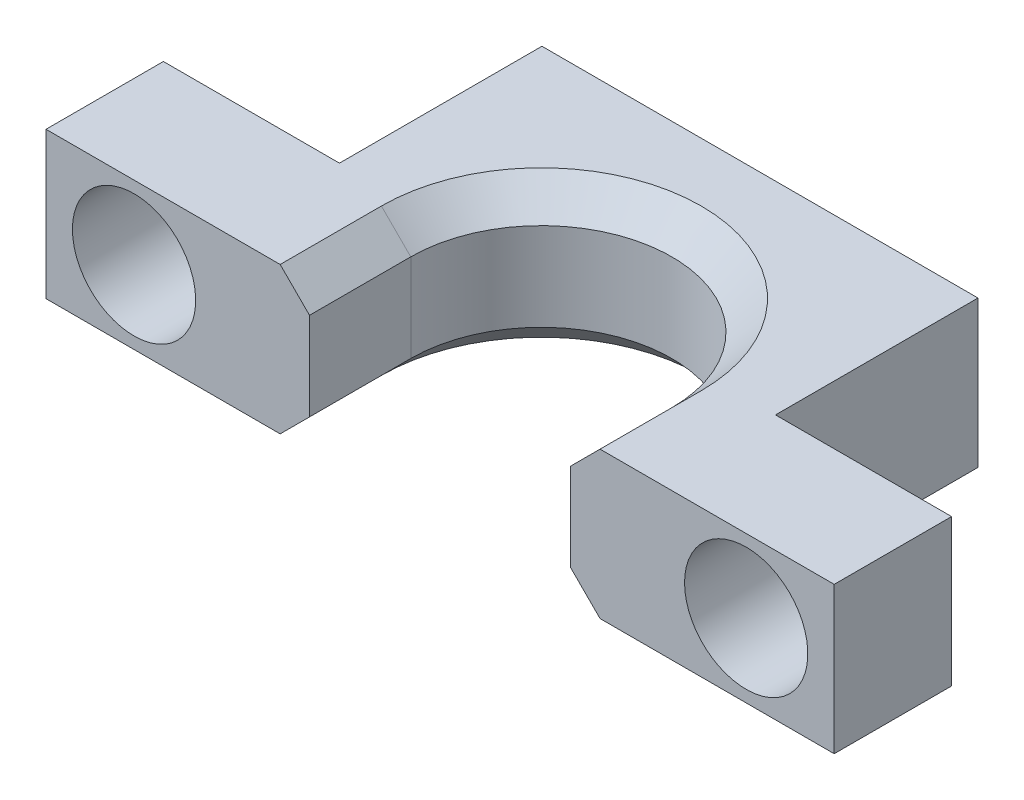
ISO-10303-21;
HEADER;
FILE_DESCRIPTION(('STEP AP214'),'2;1');
FILE_NAME('part.step','',(''),(''),'','','');
FILE_SCHEMA(('AUTOMOTIVE_DESIGN { 1 0 10303 214 1 1 1 1 }'));
ENDSEC;
DATA;
#1=APPLICATION_CONTEXT('core data for automotive mechanical design processes');
#2=APPLICATION_PROTOCOL_DEFINITION('international standard','automotive_design',2000,#1);
#3=PRODUCT_CONTEXT('',#1,'mechanical');
#4=PRODUCT('Part','Part','',(#3));
#5=PRODUCT_RELATED_PRODUCT_CATEGORY('part','',(#4));
#6=PRODUCT_DEFINITION_FORMATION('','',#4);
#7=PRODUCT_DEFINITION_CONTEXT('part definition',#1,'design');
#8=PRODUCT_DEFINITION('design','',#6,#7);
#9=PRODUCT_DEFINITION_SHAPE('','',#8);
#10=(LENGTH_UNIT() NAMED_UNIT(*) SI_UNIT(.MILLI.,.METRE.));
#11=(NAMED_UNIT(*) PLANE_ANGLE_UNIT() SI_UNIT($,.RADIAN.));
#12=(NAMED_UNIT(*) SI_UNIT($,.STERADIAN.) SOLID_ANGLE_UNIT());
#13=UNCERTAINTY_MEASURE_WITH_UNIT(LENGTH_MEASURE(1.E-05),#10,'distance_accuracy_value','');
#14=(GEOMETRIC_REPRESENTATION_CONTEXT(3) GLOBAL_UNCERTAINTY_ASSIGNED_CONTEXT((#13)) GLOBAL_UNIT_ASSIGNED_CONTEXT((#10,
#11,#12)) REPRESENTATION_CONTEXT('',''));
#15=CARTESIAN_POINT('',(0.,0.,0.));
#16=DIRECTION('',(0.,0.,1.));
#17=DIRECTION('',(1.,0.,0.));
#18=AXIS2_PLACEMENT_3D('',#15,#16,#17);
#19=CARTESIAN_POINT('',(0.,0.,0.));
#20=DIRECTION('',(0.,1.,0.));
#21=DIRECTION('',(0.,0.,1.));
#22=AXIS2_PLACEMENT_3D('',#19,#20,#21);
#23=PLANE('',#22);
#24=CARTESIAN_POINT('',(36.0770144996435,0.,-19.4606428772498));
#25=DIRECTION('',(0.,1.,0.));
#26=DIRECTION('',(0.,0.,1.));
#27=AXIS2_PLACEMENT_3D('',#24,#25,#26);
#28=CIRCLE('',#27,2.725);
#29=CARTESIAN_POINT('',(38.8020144996435,0.,-19.4606428772498));
#30=VERTEX_POINT('',#29);
#31=CARTESIAN_POINT('',(33.3520144996435,0.,-19.4606428772498));
#32=VERTEX_POINT('',#31);
#33=EDGE_CURVE('E219',#30,#32,#28,.T.);
#34=ORIENTED_EDGE('',*,*,#33,.T.);
#35=DIRECTION('',(0.,0.,1.));
#36=VECTOR('',#35,1.);
#37=CARTESIAN_POINT('',(33.3520144996435,0.,-17.7356428772498));
#38=LINE('',#37,#36);
#39=CARTESIAN_POINT('',(33.3520144996435,0.,-17.7356428772498));
#40=VERTEX_POINT('',#39);
#41=EDGE_CURVE('E221',#32,#40,#38,.T.);
#42=ORIENTED_EDGE('',*,*,#41,.T.);
#43=DIRECTION('',(-1.,0.,0.));
#44=VECTOR('',#43,1.);
#45=CARTESIAN_POINT('',(0.,0.,-17.7356428772498));
#46=LINE('',#45,#44);
#47=CARTESIAN_POINT('',(29.3621793754421,0.,-17.7356428772498));
#48=VERTEX_POINT('',#47);
#49=EDGE_CURVE('E212',#40,#48,#46,.T.);
#50=ORIENTED_EDGE('',*,*,#49,.T.);
#51=DIRECTION('',(0.,0.,-1.));
#52=VECTOR('',#51,1.);
#53=CARTESIAN_POINT('',(29.3621793754421,0.,0.));
#54=LINE('',#53,#52);
#55=CARTESIAN_POINT('',(29.3621793754421,0.,-19.7356428772498));
#56=VERTEX_POINT('',#55);
#57=EDGE_CURVE('E209',#48,#56,#54,.T.);
#58=ORIENTED_EDGE('',*,*,#57,.T.);
#59=DIRECTION('',(-1.,0.,0.));
#60=VECTOR('',#59,1.);
#61=CARTESIAN_POINT('',(0.,0.,-19.7356428772498));
#62=LINE('',#61,#60);
#63=CARTESIAN_POINT('',(32.3621793754421,0.,-19.7356428772498));
#64=VERTEX_POINT('',#63);
#65=EDGE_CURVE('E207',#64,#56,#62,.T.);
#66=ORIENTED_EDGE('',*,*,#65,.F.);
#67=DIRECTION('',(0.,0.,1.));
#68=VECTOR('',#67,1.);
#69=CARTESIAN_POINT('',(32.3621793754421,0.,0.));
#70=LINE('',#69,#68);
#71=CARTESIAN_POINT('',(32.3621793754421,0.,-23.1856428772498));
#72=VERTEX_POINT('',#71);
#73=EDGE_CURVE('E205',#72,#64,#70,.T.);
#74=ORIENTED_EDGE('',*,*,#73,.F.);
#75=DIRECTION('',(1.,0.,0.));
#76=VECTOR('',#75,1.);
#77=CARTESIAN_POINT('',(0.,0.,-23.1856428772498));
#78=LINE('',#77,#76);
#79=CARTESIAN_POINT('',(39.7918496238448,0.,-23.1856428772498));
#80=VERTEX_POINT('',#79);
#81=EDGE_CURVE('E202',#72,#80,#78,.T.);
#82=ORIENTED_EDGE('',*,*,#81,.T.);
#83=DIRECTION('',(0.,0.,-1.));
#84=VECTOR('',#83,1.);
#85=CARTESIAN_POINT('',(39.7918496238448,0.,0.));
#86=LINE('',#85,#84);
#87=CARTESIAN_POINT('',(39.7918496238448,0.,-19.7356428772497));
#88=VERTEX_POINT('',#87);
#89=EDGE_CURVE('E200',#88,#80,#86,.T.);
#90=ORIENTED_EDGE('',*,*,#89,.F.);
#91=DIRECTION('',(1.,0.,0.));
#92=VECTOR('',#91,1.);
#93=CARTESIAN_POINT('',(0.,0.,-19.7356428772497));
#94=LINE('',#93,#92);
#95=CARTESIAN_POINT('',(42.7918496238448,0.,-19.7356428772497));
#96=VERTEX_POINT('',#95);
#97=EDGE_CURVE('E197',#88,#96,#94,.T.);
#98=ORIENTED_EDGE('',*,*,#97,.T.);
#99=DIRECTION('',(0.,0.,-1.));
#100=VECTOR('',#99,1.);
#101=CARTESIAN_POINT('',(42.7918496238448,0.,0.));
#102=LINE('',#101,#100);
#103=CARTESIAN_POINT('',(42.7918496238448,0.,-17.7356428772498));
#104=VERTEX_POINT('',#103);
#105=EDGE_CURVE('E195',#104,#96,#102,.T.);
#106=ORIENTED_EDGE('',*,*,#105,.F.);
#107=DIRECTION('',(-1.,0.,0.));
#108=VECTOR('',#107,1.);
#109=CARTESIAN_POINT('',(0.,0.,-17.7356428772498));
#110=LINE('',#109,#108);
#111=CARTESIAN_POINT('',(38.8020144996435,0.,-17.7356428772498));
#112=VERTEX_POINT('',#111);
#113=EDGE_CURVE('E165',#104,#112,#110,.T.);
#114=ORIENTED_EDGE('',*,*,#113,.T.);
#115=DIRECTION('',(0.,0.,-1.));
#116=VECTOR('',#115,1.);
#117=CARTESIAN_POINT('',(38.8020144996435,0.,0.));
#118=LINE('',#117,#116);
#119=EDGE_CURVE('E217',#112,#30,#118,.T.);
#120=ORIENTED_EDGE('',*,*,#119,.T.);
#121=EDGE_LOOP('',(#34,#42,#50,#58,#66,#74,#82,#90,#98,#106,#114,#120));
#122=FACE_BOUND('',#121,.T.);
#123=ADVANCED_FACE('F35',(#122),#23,.F.);
#124=CARTESIAN_POINT('',(38.3020144996435,2.500012,0.));
#125=DIRECTION('',(1.,0.,0.));
#126=DIRECTION('',(0.,0.,-1.));
#127=AXIS2_PLACEMENT_3D('',#124,#125,#126);
#128=PLANE('',#127);
#129=DIRECTION('',(0.,-1.,0.));
#130=VECTOR('',#129,1.);
#131=CARTESIAN_POINT('',(38.3020144996435,2.500012,-17.7356428772498));
#132=LINE('',#131,#130);
#133=CARTESIAN_POINT('',(38.3020144996435,2.00000000000001,-17.7356428772498));
#134=VERTEX_POINT('',#133);
#135=CARTESIAN_POINT('',(38.3020144996435,0.50000000000001,-17.7356428772498));
#136=VERTEX_POINT('',#135);
#137=EDGE_CURVE('E166',#134,#136,#132,.T.);
#138=ORIENTED_EDGE('',*,*,#137,.F.);
#139=DIRECTION('',(0.,0.,-1.));
#140=VECTOR('',#139,1.);
#141=CARTESIAN_POINT('',(38.3020144996435,2.,-19.4606428772498));
#142=LINE('',#141,#140);
#143=CARTESIAN_POINT('',(38.3020144996435,2.00000000000001,-19.4606428772498));
#144=VERTEX_POINT('',#143);
#145=EDGE_CURVE('E44',#134,#144,#142,.T.);
#146=ORIENTED_EDGE('',*,*,#145,.T.);
#147=DIRECTION('',(0.,1.,0.));
#148=VECTOR('',#147,1.);
#149=CARTESIAN_POINT('',(38.3020144996435,-12.5,-19.4606428772498));
#150=LINE('',#149,#148);
#151=CARTESIAN_POINT('',(38.3020144996435,0.500000000000009,-19.4606428772498));
#152=VERTEX_POINT('',#151);
#153=EDGE_CURVE('E239',#152,#144,#150,.T.);
#154=ORIENTED_EDGE('',*,*,#153,.F.);
#155=DIRECTION('',(0.,0.,1.));
#156=VECTOR('',#155,1.);
#157=CARTESIAN_POINT('',(38.3020144996435,0.500000000000009,0.));
#158=LINE('',#157,#156);
#159=EDGE_CURVE('E228',#152,#136,#158,.T.);
#160=ORIENTED_EDGE('',*,*,#159,.T.);
#161=EDGE_LOOP('',(#138,#146,#154,#160));
#162=FACE_BOUND('',#161,.T.);
#163=ADVANCED_FACE('F273',(#162),#128,.F.);
#164=CARTESIAN_POINT('',(33.8520144996435,2.500012,0.));
#165=DIRECTION('',(1.,0.,0.));
#166=DIRECTION('',(0.,0.,-1.));
#167=AXIS2_PLACEMENT_3D('',#164,#165,#166);
#168=PLANE('',#167);
#169=DIRECTION('',(0.,1.,0.));
#170=VECTOR('',#169,1.);
#171=CARTESIAN_POINT('',(33.8520144996435,-12.5,-19.4606428772498));
#172=LINE('',#171,#170);
#173=CARTESIAN_POINT('',(33.8520144996435,0.500000000000009,-19.4606428772498));
#174=VERTEX_POINT('',#173);
#175=CARTESIAN_POINT('',(33.8520144996435,2.00000000000001,-19.4606428772498));
#176=VERTEX_POINT('',#175);
#177=EDGE_CURVE('E334',#174,#176,#172,.T.);
#178=ORIENTED_EDGE('',*,*,#177,.T.);
#179=DIRECTION('',(0.,0.,1.));
#180=VECTOR('',#179,1.);
#181=CARTESIAN_POINT('',(33.8520144996435,2.,0.));
#182=LINE('',#181,#180);
#183=CARTESIAN_POINT('',(33.8520144996435,2.00000000000001,-17.7356428772498));
#184=VERTEX_POINT('',#183);
#185=EDGE_CURVE('E246',#176,#184,#182,.T.);
#186=ORIENTED_EDGE('',*,*,#185,.T.);
#187=DIRECTION('',(0.,-1.,0.));
#188=VECTOR('',#187,1.);
#189=CARTESIAN_POINT('',(33.8520144996435,2.500012,-17.7356428772498));
#190=LINE('',#189,#188);
#191=CARTESIAN_POINT('',(33.8520144996435,0.50000000000001,-17.7356428772498));
#192=VERTEX_POINT('',#191);
#193=EDGE_CURVE('E172',#184,#192,#190,.T.);
#194=ORIENTED_EDGE('',*,*,#193,.T.);
#195=DIRECTION('',(0.,0.,-1.));
#196=VECTOR('',#195,1.);
#197=CARTESIAN_POINT('',(33.8520144996435,0.500000000000009,-19.4606428772498));
#198=LINE('',#197,#196);
#199=EDGE_CURVE('E214',#192,#174,#198,.T.);
#200=ORIENTED_EDGE('',*,*,#199,.T.);
#201=EDGE_LOOP('',(#178,#186,#194,#200));
#202=FACE_BOUND('',#201,.T.);
#203=ADVANCED_FACE('F279',(#202),#168,.T.);
#204=CARTESIAN_POINT('',(0.,2.500012,-17.7356428772498));
#205=DIRECTION('',(0.,0.,-1.));
#206=DIRECTION('',(-1.,0.,0.));
#207=AXIS2_PLACEMENT_3D('',#204,#205,#206);
#208=PLANE('',#207);
#209=CARTESIAN_POINT('',(30.8621793754421,1.25,-17.7356428772498));
#210=DIRECTION('',(0.,0.,-1.));
#211=DIRECTION('',(-1.,0.,0.));
#212=AXIS2_PLACEMENT_3D('',#209,#210,#211);
#213=CIRCLE('',#212,1.05);
#214=CARTESIAN_POINT('',(29.8121793754421,1.25,-17.7356428772498));
#215=VERTEX_POINT('',#214);
#216=EDGE_CURVE('E341',#215,#215,#213,.T.);
#217=ORIENTED_EDGE('',*,*,#216,.T.);
#218=EDGE_LOOP('',(#217));
#219=FACE_BOUND('',#218,.T.);
#220=ORIENTED_EDGE('',*,*,#193,.F.);
#221=DIRECTION('',(0.707106781186546,-0.707106781186549,0.));
#222=VECTOR('',#221,1.);
#223=CARTESIAN_POINT('',(33.3520144996435,2.5,-17.7356428772498));
#224=LINE('',#223,#222);
#225=CARTESIAN_POINT('',(33.3520144996435,2.5,-17.7356428772498));
#226=VERTEX_POINT('',#225);
#227=EDGE_CURVE('E248',#184,#226,#224,.F.);
#228=ORIENTED_EDGE('',*,*,#227,.T.);
#229=DIRECTION('',(-1.,0.,0.));
#230=VECTOR('',#229,1.);
#231=CARTESIAN_POINT('',(0.,2.5,-17.7356428772498));
#232=LINE('',#231,#230);
#233=CARTESIAN_POINT('',(29.3621793754421,2.5,-17.7356428772498));
#234=VERTEX_POINT('',#233);
#235=EDGE_CURVE('E192',#226,#234,#232,.T.);
#236=ORIENTED_EDGE('',*,*,#235,.T.);
#237=DIRECTION('',(0.,-1.,0.));
#238=VECTOR('',#237,1.);
#239=CARTESIAN_POINT('',(29.3621793754421,2.500012,-17.7356428772498));
#240=LINE('',#239,#238);
#241=EDGE_CURVE('E174',#234,#48,#240,.T.);
#242=ORIENTED_EDGE('',*,*,#241,.T.);
#243=ORIENTED_EDGE('',*,*,#49,.F.);
#244=DIRECTION('',(0.707106781186542,0.707106781186553,0.));
#245=VECTOR('',#244,1.);
#246=CARTESIAN_POINT('',(33.8520144996435,0.500000000000009,-17.7356428772498));
#247=LINE('',#246,#245);
#248=EDGE_CURVE('E223',#40,#192,#247,.T.);
#249=ORIENTED_EDGE('',*,*,#248,.T.);
#250=EDGE_LOOP('',(#220,#228,#236,#242,#243,#249));
#251=FACE_BOUND('',#250,.T.);
#252=ADVANCED_FACE('F304',(#219,#251),#208,.F.);
#253=CARTESIAN_POINT('',(29.3621793754421,2.500012,0.));
#254=DIRECTION('',(1.,0.,0.));
#255=DIRECTION('',(0.,0.,-1.));
#256=AXIS2_PLACEMENT_3D('',#253,#254,#255);
#257=PLANE('',#256);
#258=DIRECTION('',(0.,0.,-1.));
#259=VECTOR('',#258,1.);
#260=CARTESIAN_POINT('',(29.3621793754421,2.5,0.));
#261=LINE('',#260,#259);
#262=CARTESIAN_POINT('',(29.3621793754421,2.5,-19.7356428772498));
#263=VERTEX_POINT('',#262);
#264=EDGE_CURVE('E190',#234,#263,#261,.T.);
#265=ORIENTED_EDGE('',*,*,#264,.T.);
#266=DIRECTION('',(0.,-1.,0.));
#267=VECTOR('',#266,1.);
#268=CARTESIAN_POINT('',(29.3621793754421,2.500012,-19.7356428772498));
#269=LINE('',#268,#267);
#270=EDGE_CURVE('E313',#263,#56,#269,.T.);
#271=ORIENTED_EDGE('',*,*,#270,.T.);
#272=ORIENTED_EDGE('',*,*,#57,.F.);
#273=ORIENTED_EDGE('',*,*,#241,.F.);
#274=EDGE_LOOP('',(#265,#271,#272,#273));
#275=FACE_BOUND('',#274,.T.);
#276=ADVANCED_FACE('F311',(#275),#257,.F.);
#277=CARTESIAN_POINT('',(0.,2.500012,-19.7356428772498));
#278=DIRECTION('',(0.,0.,-1.));
#279=DIRECTION('',(-1.,0.,0.));
#280=AXIS2_PLACEMENT_3D('',#277,#278,#279);
#281=PLANE('',#280);
#282=CARTESIAN_POINT('',(30.8621793754421,1.25,-19.7356428772497));
#283=DIRECTION('',(0.,0.,-1.));
#284=DIRECTION('',(-1.,0.,0.));
#285=AXIS2_PLACEMENT_3D('',#282,#283,#284);
#286=CIRCLE('',#285,1.05);
#287=CARTESIAN_POINT('',(29.8121793754421,1.25,-19.7356428772497));
#288=VERTEX_POINT('',#287);
#289=EDGE_CURVE('E344',#288,#288,#286,.T.);
#290=ORIENTED_EDGE('',*,*,#289,.F.);
#291=EDGE_LOOP('',(#290));
#292=FACE_BOUND('',#291,.T.);
#293=DIRECTION('',(0.,-1.,0.));
#294=VECTOR('',#293,1.);
#295=CARTESIAN_POINT('',(32.3621793754421,2.500012,-19.7356428772498));
#296=LINE('',#295,#294);
#297=CARTESIAN_POINT('',(32.3621793754421,2.5,-19.7356428772498));
#298=VERTEX_POINT('',#297);
#299=EDGE_CURVE('E319',#298,#64,#296,.T.);
#300=ORIENTED_EDGE('',*,*,#299,.T.);
#301=ORIENTED_EDGE('',*,*,#65,.T.);
#302=ORIENTED_EDGE('',*,*,#270,.F.);
#303=DIRECTION('',(-1.,0.,0.));
#304=VECTOR('',#303,1.);
#305=CARTESIAN_POINT('',(0.,2.5,-19.7356428772498));
#306=LINE('',#305,#304);
#307=EDGE_CURVE('E187',#298,#263,#306,.T.);
#308=ORIENTED_EDGE('',*,*,#307,.F.);
#309=EDGE_LOOP('',(#300,#301,#302,#308));
#310=FACE_BOUND('',#309,.T.);
#311=ADVANCED_FACE('F316',(#292,#310),#281,.T.);
#312=CARTESIAN_POINT('',(32.3621793754421,2.500012,0.));
#313=DIRECTION('',(-1.,0.,0.));
#314=DIRECTION('',(0.,0.,1.));
#315=AXIS2_PLACEMENT_3D('',#312,#313,#314);
#316=PLANE('',#315);
#317=DIRECTION('',(0.,-1.,0.));
#318=VECTOR('',#317,1.);
#319=CARTESIAN_POINT('',(32.3621793754421,2.500012,-23.1856428772498));
#320=LINE('',#319,#318);
#321=CARTESIAN_POINT('',(32.3621793754421,2.5,-23.1856428772498));
#322=VERTEX_POINT('',#321);
#323=EDGE_CURVE('E321',#322,#72,#320,.T.);
#324=ORIENTED_EDGE('',*,*,#323,.T.);
#325=ORIENTED_EDGE('',*,*,#73,.T.);
#326=ORIENTED_EDGE('',*,*,#299,.F.);
#327=DIRECTION('',(0.,0.,1.));
#328=VECTOR('',#327,1.);
#329=CARTESIAN_POINT('',(32.3621793754421,2.5,0.));
#330=LINE('',#329,#328);
#331=EDGE_CURVE('E184',#322,#298,#330,.T.);
#332=ORIENTED_EDGE('',*,*,#331,.F.);
#333=EDGE_LOOP('',(#324,#325,#326,#332));
#334=FACE_BOUND('',#333,.T.);
#335=ADVANCED_FACE('F351',(#334),#316,.T.);
#336=CARTESIAN_POINT('',(0.,2.500012,-23.1856428772498));
#337=DIRECTION('',(0.,0.,1.));
#338=DIRECTION('',(1.,0.,0.));
#339=AXIS2_PLACEMENT_3D('',#336,#337,#338);
#340=PLANE('',#339);
#341=DIRECTION('',(1.,0.,0.));
#342=VECTOR('',#341,1.);
#343=CARTESIAN_POINT('',(0.,2.5,-23.1856428772498));
#344=LINE('',#343,#342);
#345=CARTESIAN_POINT('',(39.7918496238448,2.5,-23.1856428772498));
#346=VERTEX_POINT('',#345);
#347=EDGE_CURVE('E182',#322,#346,#344,.T.);
#348=ORIENTED_EDGE('',*,*,#347,.T.);
#349=DIRECTION('',(0.,-1.,0.));
#350=VECTOR('',#349,1.);
#351=CARTESIAN_POINT('',(39.7918496238448,2.500012,-23.1856428772498));
#352=LINE('',#351,#350);
#353=EDGE_CURVE('E326',#346,#80,#352,.T.);
#354=ORIENTED_EDGE('',*,*,#353,.T.);
#355=ORIENTED_EDGE('',*,*,#81,.F.);
#356=ORIENTED_EDGE('',*,*,#323,.F.);
#357=EDGE_LOOP('',(#348,#354,#355,#356));
#358=FACE_BOUND('',#357,.T.);
#359=ADVANCED_FACE('F357',(#358),#340,.F.);
#360=CARTESIAN_POINT('',(39.7918496238448,2.500012,0.));
#361=DIRECTION('',(1.,0.,0.));
#362=DIRECTION('',(0.,0.,-1.));
#363=AXIS2_PLACEMENT_3D('',#360,#361,#362);
#364=PLANE('',#363);
#365=DIRECTION('',(0.,-1.,0.));
#366=VECTOR('',#365,1.);
#367=CARTESIAN_POINT('',(39.7918496238448,2.500012,-19.7356428772497));
#368=LINE('',#367,#366);
#369=CARTESIAN_POINT('',(39.7918496238448,2.5,-19.7356428772497));
#370=VERTEX_POINT('',#369);
#371=EDGE_CURVE('E329',#370,#88,#368,.T.);
#372=ORIENTED_EDGE('',*,*,#371,.T.);
#373=ORIENTED_EDGE('',*,*,#89,.T.);
#374=ORIENTED_EDGE('',*,*,#353,.F.);
#375=DIRECTION('',(0.,0.,-1.));
#376=VECTOR('',#375,1.);
#377=CARTESIAN_POINT('',(39.7918496238448,2.5,0.));
#378=LINE('',#377,#376);
#379=EDGE_CURVE('E179',#370,#346,#378,.T.);
#380=ORIENTED_EDGE('',*,*,#379,.F.);
#381=EDGE_LOOP('',(#372,#373,#374,#380));
#382=FACE_BOUND('',#381,.T.);
#383=ADVANCED_FACE('F392',(#382),#364,.T.);
#384=CARTESIAN_POINT('',(0.,2.500012,-19.7356428772497));
#385=DIRECTION('',(0.,0.,1.));
#386=DIRECTION('',(1.,0.,0.));
#387=AXIS2_PLACEMENT_3D('',#384,#385,#386);
#388=PLANE('',#387);
#389=CARTESIAN_POINT('',(41.2918496238448,1.25,-19.7356428772497));
#390=DIRECTION('',(0.,0.,-1.));
#391=DIRECTION('',(-1.,0.,0.));
#392=AXIS2_PLACEMENT_3D('',#389,#390,#391);
#393=CIRCLE('',#392,1.05);
#394=CARTESIAN_POINT('',(40.2418496238448,1.25,-19.7356428772497));
#395=VERTEX_POINT('',#394);
#396=EDGE_CURVE('E338',#395,#395,#393,.T.);
#397=ORIENTED_EDGE('',*,*,#396,.F.);
#398=EDGE_LOOP('',(#397));
#399=FACE_BOUND('',#398,.T.);
#400=DIRECTION('',(1.,0.,0.));
#401=VECTOR('',#400,1.);
#402=CARTESIAN_POINT('',(0.,2.5,-19.7356428772497));
#403=LINE('',#402,#401);
#404=CARTESIAN_POINT('',(42.7918496238448,2.5,-19.7356428772497));
#405=VERTEX_POINT('',#404);
#406=EDGE_CURVE('E160',#370,#405,#403,.T.);
#407=ORIENTED_EDGE('',*,*,#406,.T.);
#408=DIRECTION('',(0.,-1.,0.));
#409=VECTOR('',#408,1.);
#410=CARTESIAN_POINT('',(42.7918496238448,2.500012,-19.7356428772497));
#411=LINE('',#410,#409);
#412=EDGE_CURVE('E156',#405,#96,#411,.T.);
#413=ORIENTED_EDGE('',*,*,#412,.T.);
#414=ORIENTED_EDGE('',*,*,#97,.F.);
#415=ORIENTED_EDGE('',*,*,#371,.F.);
#416=EDGE_LOOP('',(#407,#413,#414,#415));
#417=FACE_BOUND('',#416,.T.);
#418=ADVANCED_FACE('F394',(#399,#417),#388,.F.);
#419=CARTESIAN_POINT('',(42.7918496238448,2.500012,0.));
#420=DIRECTION('',(1.,0.,0.));
#421=DIRECTION('',(0.,0.,-1.));
#422=AXIS2_PLACEMENT_3D('',#419,#420,#421);
#423=PLANE('',#422);
#424=DIRECTION('',(0.,-1.,0.));
#425=VECTOR('',#424,1.);
#426=CARTESIAN_POINT('',(42.7918496238448,2.500012,-17.7356428772498));
#427=LINE('',#426,#425);
#428=CARTESIAN_POINT('',(42.7918496238448,2.5,-17.7356428772498));
#429=VERTEX_POINT('',#428);
#430=EDGE_CURVE('E153',#429,#104,#427,.T.);
#431=ORIENTED_EDGE('',*,*,#430,.T.);
#432=ORIENTED_EDGE('',*,*,#105,.T.);
#433=ORIENTED_EDGE('',*,*,#412,.F.);
#434=DIRECTION('',(0.,0.,-1.));
#435=VECTOR('',#434,1.);
#436=CARTESIAN_POINT('',(42.7918496238448,2.5,0.));
#437=LINE('',#436,#435);
#438=EDGE_CURVE('E150',#429,#405,#437,.T.);
#439=ORIENTED_EDGE('',*,*,#438,.F.);
#440=EDGE_LOOP('',(#431,#432,#433,#439));
#441=FACE_BOUND('',#440,.T.);
#442=ADVANCED_FACE('F152',(#441),#423,.T.);
#443=CARTESIAN_POINT('',(41.2918496238448,1.25,-17.7356428772498));
#444=DIRECTION('',(0.,0.,-1.));
#445=DIRECTION('',(-1.,0.,0.));
#446=AXIS2_PLACEMENT_3D('',#443,#444,#445);
#447=CIRCLE('',#446,1.05);
#448=CARTESIAN_POINT('',(40.2418496238448,1.25,-17.7356428772498));
#449=VERTEX_POINT('',#448);
#450=EDGE_CURVE('E39',#449,#449,#447,.T.);
#451=ORIENTED_EDGE('',*,*,#450,.T.);
#452=EDGE_LOOP('',(#451));
#453=FACE_BOUND('',#452,.T.);
#454=DIRECTION('',(-1.,0.,0.));
#455=VECTOR('',#454,1.);
#456=CARTESIAN_POINT('',(0.,2.5,-17.7356428772498));
#457=LINE('',#456,#455);
#458=CARTESIAN_POINT('',(38.8020144996434,2.5,-17.7356428772498));
#459=VERTEX_POINT('',#458);
#460=EDGE_CURVE('E161',#429,#459,#457,.T.);
#461=ORIENTED_EDGE('',*,*,#460,.T.);
#462=DIRECTION('',(-0.707106781186546,-0.707106781186549,0.));
#463=VECTOR('',#462,1.);
#464=CARTESIAN_POINT('',(38.3020144996435,2.,-17.7356428772498));
#465=LINE('',#464,#463);
#466=EDGE_CURVE('E11',#459,#134,#465,.T.);
#467=ORIENTED_EDGE('',*,*,#466,.T.);
#468=ORIENTED_EDGE('',*,*,#137,.T.);
#469=DIRECTION('',(-0.707106781186542,0.707106781186553,0.));
#470=VECTOR('',#469,1.);
#471=CARTESIAN_POINT('',(38.8020144996435,0.,-17.7356428772498));
#472=LINE('',#471,#470);
#473=EDGE_CURVE('E231',#136,#112,#472,.F.);
#474=ORIENTED_EDGE('',*,*,#473,.T.);
#475=ORIENTED_EDGE('',*,*,#113,.F.);
#476=ORIENTED_EDGE('',*,*,#430,.F.);
#477=EDGE_LOOP('',(#461,#467,#468,#474,#475,#476));
#478=FACE_BOUND('',#477,.T.);
#479=ADVANCED_FACE('F163',(#453,#478),#208,.F.);
#480=CARTESIAN_POINT('',(36.0770144996435,-12.5,-19.4606428772498));
#481=DIRECTION('',(0.,1.,0.));
#482=DIRECTION('',(0.,0.,1.));
#483=AXIS2_PLACEMENT_3D('',#480,#481,#482);
#484=CYLINDRICAL_SURFACE('',#483,2.225);
#485=ORIENTED_EDGE('',*,*,#153,.T.);
#486=CARTESIAN_POINT('',(36.0770144996435,2.00000000000001,-19.4606428772498));
#487=DIRECTION('',(0.,1.,0.));
#488=DIRECTION('',(0.,0.,1.));
#489=AXIS2_PLACEMENT_3D('',#486,#487,#488);
#490=CIRCLE('',#489,2.225);
#491=EDGE_CURVE('E250',#144,#176,#490,.T.);
#492=ORIENTED_EDGE('',*,*,#491,.T.);
#493=ORIENTED_EDGE('',*,*,#177,.F.);
#494=CARTESIAN_POINT('',(36.0770144996435,0.500000000000009,-19.4606428772498));
#495=DIRECTION('',(0.,1.,0.));
#496=DIRECTION('',(0.,0.,1.));
#497=AXIS2_PLACEMENT_3D('',#494,#495,#496);
#498=CIRCLE('',#497,2.225);
#499=EDGE_CURVE('E226',#174,#152,#498,.F.);
#500=ORIENTED_EDGE('',*,*,#499,.T.);
#501=EDGE_LOOP('',(#485,#492,#493,#500));
#502=FACE_BOUND('',#501,.T.);
#503=ADVANCED_FACE('F373',(#502),#484,.F.);
#504=CARTESIAN_POINT('',(0.,2.5,0.));
#505=DIRECTION('',(0.,1.,0.));
#506=DIRECTION('',(0.,0.,1.));
#507=AXIS2_PLACEMENT_3D('',#504,#505,#506);
#508=PLANE('',#507);
#509=ORIENTED_EDGE('',*,*,#235,.F.);
#510=DIRECTION('',(0.,0.,-1.));
#511=VECTOR('',#510,1.);
#512=CARTESIAN_POINT('',(33.3520144996435,2.5,0.));
#513=LINE('',#512,#511);
#514=CARTESIAN_POINT('',(33.3520144996435,2.5,-19.4606428772498));
#515=VERTEX_POINT('',#514);
#516=EDGE_CURVE('E243',#226,#515,#513,.T.);
#517=ORIENTED_EDGE('',*,*,#516,.T.);
#518=CARTESIAN_POINT('',(36.0770144996435,2.5,-19.4606428772498));
#519=DIRECTION('',(0.,1.,0.));
#520=DIRECTION('',(0.,0.,1.));
#521=AXIS2_PLACEMENT_3D('',#518,#519,#520);
#522=CIRCLE('',#521,2.72499999999999);
#523=CARTESIAN_POINT('',(38.8020144996434,2.5,-19.4606428772498));
#524=VERTEX_POINT('',#523);
#525=EDGE_CURVE('E241',#515,#524,#522,.F.);
#526=ORIENTED_EDGE('',*,*,#525,.T.);
#527=DIRECTION('',(0.,0.,1.));
#528=VECTOR('',#527,1.);
#529=CARTESIAN_POINT('',(38.8020144996434,2.5,-17.7356428772498));
#530=LINE('',#529,#528);
#531=EDGE_CURVE('E171',#524,#459,#530,.T.);
#532=ORIENTED_EDGE('',*,*,#531,.T.);
#533=ORIENTED_EDGE('',*,*,#460,.F.);
#534=ORIENTED_EDGE('',*,*,#438,.T.);
#535=ORIENTED_EDGE('',*,*,#406,.F.);
#536=ORIENTED_EDGE('',*,*,#379,.T.);
#537=ORIENTED_EDGE('',*,*,#347,.F.);
#538=ORIENTED_EDGE('',*,*,#331,.T.);
#539=ORIENTED_EDGE('',*,*,#307,.T.);
#540=ORIENTED_EDGE('',*,*,#264,.F.);
#541=EDGE_LOOP('',(#509,#517,#526,#532,#533,#534,#535,#536,#537,#538,#539,#540));
#542=FACE_BOUND('',#541,.T.);
#543=ADVANCED_FACE('F169',(#542),#508,.T.);
#544=CARTESIAN_POINT('',(38.8020144996435,0.,0.));
#545=DIRECTION('',(0.707106781186553,0.707106781186542,0.));
#546=DIRECTION('',(0.,0.,-1.));
#547=AXIS2_PLACEMENT_3D('',#544,#545,#546);
#548=PLANE('',#547);
#549=ORIENTED_EDGE('',*,*,#473,.F.);
#550=ORIENTED_EDGE('',*,*,#159,.F.);
#551=DIRECTION('',(-0.707106781186542,0.707106781186553,0.));
#552=VECTOR('',#551,1.);
#553=CARTESIAN_POINT('',(38.8020144996435,0.,-19.4606428772498));
#554=LINE('',#553,#552);
#555=EDGE_CURVE('E235',#30,#152,#554,.T.);
#556=ORIENTED_EDGE('',*,*,#555,.F.);
#557=ORIENTED_EDGE('',*,*,#119,.F.);
#558=EDGE_LOOP('',(#549,#550,#556,#557));
#559=FACE_BOUND('',#558,.T.);
#560=ADVANCED_FACE('F285',(#559),#548,.F.);
#561=CARTESIAN_POINT('',(36.0770144996435,0.500000000000009,-19.4606428772498));
#562=DIRECTION('',(0.,-1.,0.));
#563=DIRECTION('',(0.,0.,-1.));
#564=AXIS2_PLACEMENT_3D('',#561,#562,#563);
#565=CONICAL_SURFACE('',#564,2.225,0.78539816339744);
#566=ORIENTED_EDGE('',*,*,#555,.T.);
#567=ORIENTED_EDGE('',*,*,#499,.F.);
#568=DIRECTION('',(0.707106781186541,0.707106781186554,0.));
#569=VECTOR('',#568,1.);
#570=CARTESIAN_POINT('',(33.3520144996435,0.,-19.4606428772498));
#571=LINE('',#570,#569);
#572=EDGE_CURVE('E233',#32,#174,#571,.T.);
#573=ORIENTED_EDGE('',*,*,#572,.F.);
#574=ORIENTED_EDGE('',*,*,#33,.F.);
#575=EDGE_LOOP('',(#566,#567,#573,#574));
#576=FACE_BOUND('',#575,.T.);
#577=ADVANCED_FACE('F269',(#576),#565,.F.);
#578=CARTESIAN_POINT('',(33.8520144996435,0.500000000000009,0.));
#579=DIRECTION('',(0.707106781186553,-0.707106781186542,0.));
#580=DIRECTION('',(0.,0.,1.));
#581=AXIS2_PLACEMENT_3D('',#578,#579,#580);
#582=PLANE('',#581);
#583=ORIENTED_EDGE('',*,*,#248,.F.);
#584=ORIENTED_EDGE('',*,*,#41,.F.);
#585=ORIENTED_EDGE('',*,*,#572,.T.);
#586=ORIENTED_EDGE('',*,*,#199,.F.);
#587=EDGE_LOOP('',(#583,#584,#585,#586));
#588=FACE_BOUND('',#587,.T.);
#589=ADVANCED_FACE('F263',(#588),#582,.T.);
#590=CARTESIAN_POINT('',(38.3020144996435,2.,0.));
#591=DIRECTION('',(-0.707106781186549,0.707106781186546,0.));
#592=DIRECTION('',(0.,0.,1.));
#593=AXIS2_PLACEMENT_3D('',#590,#591,#592);
#594=PLANE('',#593);
#595=ORIENTED_EDGE('',*,*,#466,.F.);
#596=ORIENTED_EDGE('',*,*,#531,.F.);
#597=DIRECTION('',(0.707106781186546,0.707106781186549,0.));
#598=VECTOR('',#597,1.);
#599=CARTESIAN_POINT('',(38.3020144996435,2.,-19.4606428772498));
#600=LINE('',#599,#598);
#601=EDGE_CURVE('E236',#144,#524,#600,.T.);
#602=ORIENTED_EDGE('',*,*,#601,.F.);
#603=ORIENTED_EDGE('',*,*,#145,.F.);
#604=EDGE_LOOP('',(#595,#596,#602,#603));
#605=FACE_BOUND('',#604,.T.);
#606=ADVANCED_FACE('F37',(#605),#594,.T.);
#607=CARTESIAN_POINT('',(36.0770144996435,2.5,-19.4606428772498));
#608=DIRECTION('',(0.,1.,0.));
#609=DIRECTION('',(0.,0.,1.));
#610=AXIS2_PLACEMENT_3D('',#607,#608,#609);
#611=CONICAL_SURFACE('',#610,2.72499999999999,0.785398163397447);
#612=ORIENTED_EDGE('',*,*,#601,.T.);
#613=ORIENTED_EDGE('',*,*,#525,.F.);
#614=DIRECTION('',(-0.707106781186547,0.707106781186548,0.));
#615=VECTOR('',#614,1.);
#616=CARTESIAN_POINT('',(33.8520144996435,2.00000000000001,-19.4606428772498));
#617=LINE('',#616,#615);
#618=EDGE_CURVE('E253',#176,#515,#617,.T.);
#619=ORIENTED_EDGE('',*,*,#618,.F.);
#620=ORIENTED_EDGE('',*,*,#491,.F.);
#621=EDGE_LOOP('',(#612,#613,#619,#620));
#622=FACE_BOUND('',#621,.T.);
#623=ADVANCED_FACE('F259',(#622),#611,.F.);
#624=CARTESIAN_POINT('',(33.3520144996435,2.5,0.));
#625=DIRECTION('',(-0.707106781186549,-0.707106781186546,0.));
#626=DIRECTION('',(0.,0.,-1.));
#627=AXIS2_PLACEMENT_3D('',#624,#625,#626);
#628=PLANE('',#627);
#629=ORIENTED_EDGE('',*,*,#227,.F.);
#630=ORIENTED_EDGE('',*,*,#185,.F.);
#631=ORIENTED_EDGE('',*,*,#618,.T.);
#632=ORIENTED_EDGE('',*,*,#516,.F.);
#633=EDGE_LOOP('',(#629,#630,#631,#632));
#634=FACE_BOUND('',#633,.T.);
#635=ADVANCED_FACE('F268',(#634),#628,.F.);
#636=CARTESIAN_POINT('',(41.2918496238448,1.25,-9.73564287724974));
#637=DIRECTION('',(0.,0.,-1.));
#638=DIRECTION('',(-1.,0.,0.));
#639=AXIS2_PLACEMENT_3D('',#636,#637,#638);
#640=CYLINDRICAL_SURFACE('',#639,1.05);
#641=ORIENTED_EDGE('',*,*,#396,.T.);
#642=EDGE_LOOP('',(#641));
#643=FACE_BOUND('',#642,.T.);
#644=ORIENTED_EDGE('',*,*,#450,.F.);
#645=EDGE_LOOP('',(#644));
#646=FACE_BOUND('',#645,.T.);
#647=ADVANCED_FACE('F291',(#643,#646),#640,.F.);
#648=CARTESIAN_POINT('',(30.8621793754421,1.25,-9.73564287724974));
#649=DIRECTION('',(0.,0.,-1.));
#650=DIRECTION('',(-1.,0.,0.));
#651=AXIS2_PLACEMENT_3D('',#648,#649,#650);
#652=CYLINDRICAL_SURFACE('',#651,1.05);
#653=ORIENTED_EDGE('',*,*,#289,.T.);
#654=EDGE_LOOP('',(#653));
#655=FACE_BOUND('',#654,.T.);
#656=ORIENTED_EDGE('',*,*,#216,.F.);
#657=EDGE_LOOP('',(#656));
#658=FACE_BOUND('',#657,.T.);
#659=ADVANCED_FACE('F296',(#655,#658),#652,.F.);
#660=CLOSED_SHELL('',(#123,#163,#203,#252,#276,#311,#335,#359,#383,#418,#442,#479,#503,#543,
#560,#577,#589,#606,#623,#635,#647,#659));
#661=MANIFOLD_SOLID_BREP('B2',#660);
#662=ADVANCED_BREP_SHAPE_REPRESENTATION('',(#18,#661),#14);
#663=SHAPE_DEFINITION_REPRESENTATION(#9,#662);
ENDSEC;
END-ISO-10303-21;
